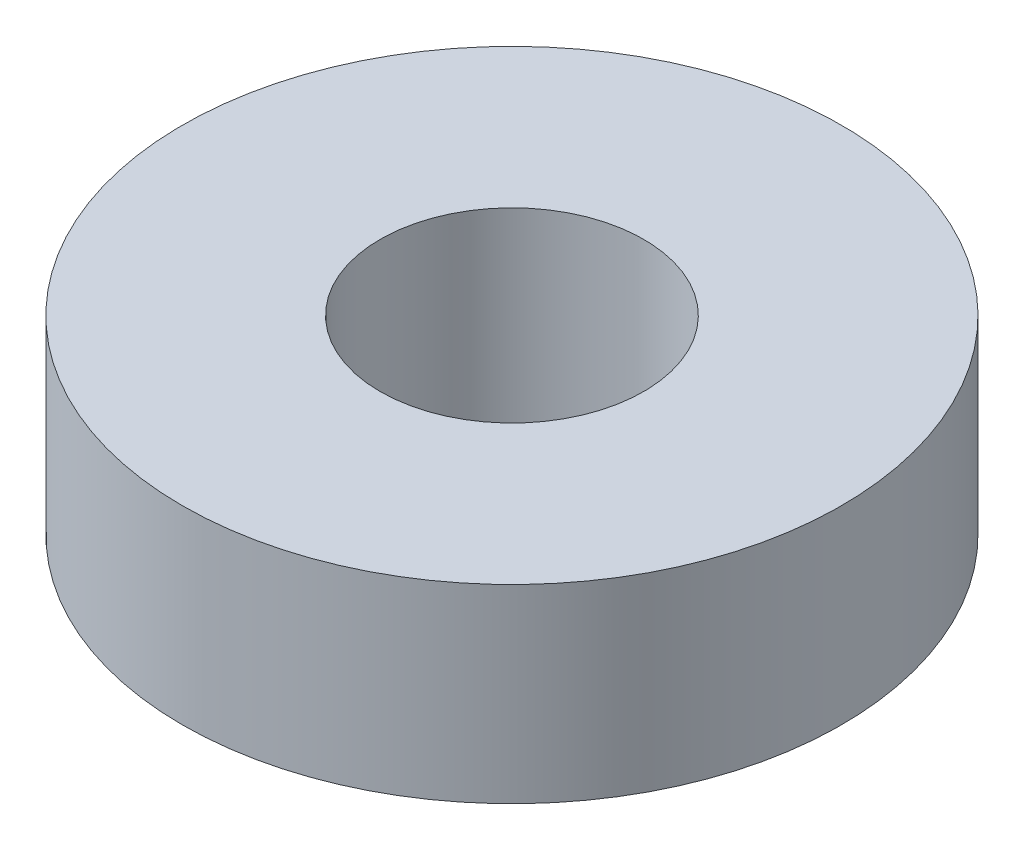
ISO-10303-21;
HEADER;
FILE_DESCRIPTION(('STEP AP214'),'2;1');
FILE_NAME('part.step','',(''),(''),'','','');
FILE_SCHEMA(('AUTOMOTIVE_DESIGN { 1 0 10303 214 1 1 1 1 }'));
ENDSEC;
DATA;
#1=APPLICATION_CONTEXT('core data for automotive mechanical design processes');
#2=APPLICATION_PROTOCOL_DEFINITION('international standard','automotive_design',2000,#1);
#3=PRODUCT_CONTEXT('',#1,'mechanical');
#4=PRODUCT('Part','Part','',(#3));
#5=PRODUCT_RELATED_PRODUCT_CATEGORY('part','',(#4));
#6=PRODUCT_DEFINITION_FORMATION('','',#4);
#7=PRODUCT_DEFINITION_CONTEXT('part definition',#1,'design');
#8=PRODUCT_DEFINITION('design','',#6,#7);
#9=PRODUCT_DEFINITION_SHAPE('','',#8);
#10=(LENGTH_UNIT() NAMED_UNIT(*) SI_UNIT(.MILLI.,.METRE.));
#11=(NAMED_UNIT(*) PLANE_ANGLE_UNIT() SI_UNIT($,.RADIAN.));
#12=(NAMED_UNIT(*) SI_UNIT($,.STERADIAN.) SOLID_ANGLE_UNIT());
#13=UNCERTAINTY_MEASURE_WITH_UNIT(LENGTH_MEASURE(1.E-05),#10,'distance_accuracy_value','');
#14=(GEOMETRIC_REPRESENTATION_CONTEXT(3) GLOBAL_UNCERTAINTY_ASSIGNED_CONTEXT((#13)) GLOBAL_UNIT_ASSIGNED_CONTEXT((#10,
#11,#12)) REPRESENTATION_CONTEXT('',''));
#15=CARTESIAN_POINT('',(0.,0.,0.));
#16=DIRECTION('',(0.,0.,1.));
#17=DIRECTION('',(1.,0.,0.));
#18=AXIS2_PLACEMENT_3D('',#15,#16,#17);
#19=CARTESIAN_POINT('',(0.,9.144,0.));
#20=DIRECTION('',(0.,1.,0.));
#21=DIRECTION('',(0.,0.,1.));
#22=AXIS2_PLACEMENT_3D('',#19,#20,#21);
#23=PLANE('',#22);
#24=CARTESIAN_POINT('',(0.,9.144,0.));
#25=DIRECTION('',(0.,1.,0.));
#26=DIRECTION('',(0.,0.,1.));
#27=AXIS2_PLACEMENT_3D('',#24,#25,#26);
#28=CIRCLE('',#27,15.875);
#29=CARTESIAN_POINT('',(0.,9.144,15.875));
#30=VERTEX_POINT('',#29);
#31=EDGE_CURVE('E10',#30,#30,#28,.T.);
#32=ORIENTED_EDGE('',*,*,#31,.T.);
#33=EDGE_LOOP('',(#32));
#34=FACE_BOUND('',#33,.T.);
#35=CARTESIAN_POINT('',(0.,9.144,0.));
#36=DIRECTION('',(0.,1.,0.));
#37=DIRECTION('',(0.,0.,1.));
#38=AXIS2_PLACEMENT_3D('',#35,#36,#37);
#39=CIRCLE('',#38,6.35);
#40=CARTESIAN_POINT('',(0.,9.144,6.35));
#41=VERTEX_POINT('',#40);
#42=EDGE_CURVE('E42',#41,#41,#39,.T.);
#43=ORIENTED_EDGE('',*,*,#42,.F.);
#44=EDGE_LOOP('',(#43));
#45=FACE_BOUND('',#44,.T.);
#46=ADVANCED_FACE('F31',(#34,#45),#23,.T.);
#47=CARTESIAN_POINT('',(0.,0.,0.));
#48=DIRECTION('',(0.,1.,0.));
#49=DIRECTION('',(0.,0.,1.));
#50=AXIS2_PLACEMENT_3D('',#47,#48,#49);
#51=PLANE('',#50);
#52=CARTESIAN_POINT('',(0.,0.,0.));
#53=DIRECTION('',(0.,1.,0.));
#54=DIRECTION('',(0.,0.,1.));
#55=AXIS2_PLACEMENT_3D('',#52,#53,#54);
#56=CIRCLE('',#55,15.875);
#57=CARTESIAN_POINT('',(0.,0.,15.875));
#58=VERTEX_POINT('',#57);
#59=EDGE_CURVE('E35',#58,#58,#56,.T.);
#60=ORIENTED_EDGE('',*,*,#59,.F.);
#61=EDGE_LOOP('',(#60));
#62=FACE_BOUND('',#61,.T.);
#63=CARTESIAN_POINT('',(0.,0.,0.));
#64=DIRECTION('',(0.,1.,0.));
#65=DIRECTION('',(0.,0.,1.));
#66=AXIS2_PLACEMENT_3D('',#63,#64,#65);
#67=CIRCLE('',#66,6.35);
#68=CARTESIAN_POINT('',(0.,0.,6.35));
#69=VERTEX_POINT('',#68);
#70=EDGE_CURVE('E44',#69,#69,#67,.T.);
#71=ORIENTED_EDGE('',*,*,#70,.T.);
#72=EDGE_LOOP('',(#71));
#73=FACE_BOUND('',#72,.T.);
#74=ADVANCED_FACE('F54',(#62,#73),#51,.F.);
#75=CARTESIAN_POINT('',(0.,9.144,0.));
#76=DIRECTION('',(0.,-1.,0.));
#77=DIRECTION('',(0.,0.,-1.));
#78=AXIS2_PLACEMENT_3D('',#75,#76,#77);
#79=CYLINDRICAL_SURFACE('',#78,15.875);
#80=ORIENTED_EDGE('',*,*,#31,.F.);
#81=EDGE_LOOP('',(#80));
#82=FACE_BOUND('',#81,.T.);
#83=ORIENTED_EDGE('',*,*,#59,.T.);
#84=EDGE_LOOP('',(#83));
#85=FACE_BOUND('',#84,.T.);
#86=ADVANCED_FACE('F33',(#82,#85),#79,.T.);
#87=CARTESIAN_POINT('',(0.,9.144,0.));
#88=DIRECTION('',(0.,-1.,0.));
#89=DIRECTION('',(0.,0.,-1.));
#90=AXIS2_PLACEMENT_3D('',#87,#88,#89);
#91=CYLINDRICAL_SURFACE('',#90,6.35);
#92=ORIENTED_EDGE('',*,*,#42,.T.);
#93=EDGE_LOOP('',(#92));
#94=FACE_BOUND('',#93,.T.);
#95=ORIENTED_EDGE('',*,*,#70,.F.);
#96=EDGE_LOOP('',(#95));
#97=FACE_BOUND('',#96,.T.);
#98=ADVANCED_FACE('F50',(#94,#97),#91,.F.);
#99=CLOSED_SHELL('',(#46,#74,#86,#98));
#100=MANIFOLD_SOLID_BREP('B2',#99);
#101=ADVANCED_BREP_SHAPE_REPRESENTATION('',(#18,#100),#14);
#102=SHAPE_DEFINITION_REPRESENTATION(#9,#101);
ENDSEC;
END-ISO-10303-21;
